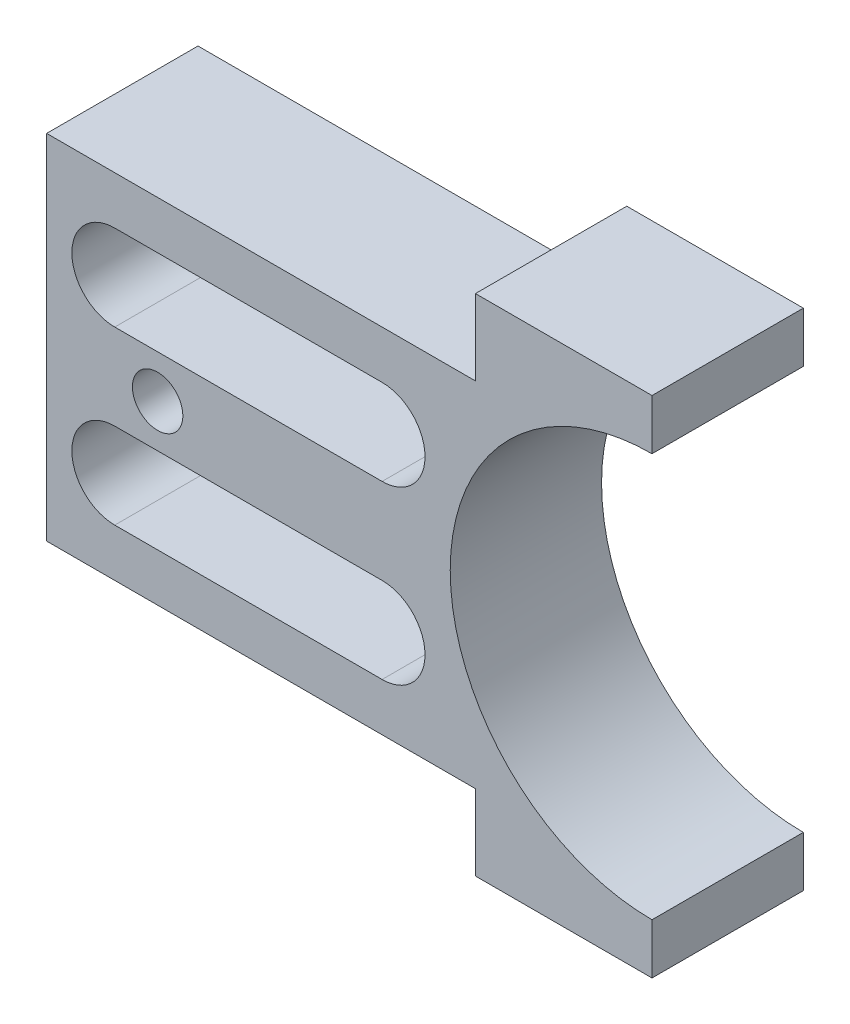
ISO-10303-21;
HEADER;
FILE_DESCRIPTION(('STEP AP214'),'2;1');
FILE_NAME('part.step','',(''),(''),'','','');
FILE_SCHEMA(('AUTOMOTIVE_DESIGN { 1 0 10303 214 1 1 1 1 }'));
ENDSEC;
DATA;
#1=APPLICATION_CONTEXT('core data for automotive mechanical design processes');
#2=APPLICATION_PROTOCOL_DEFINITION('international standard','automotive_design',2000,#1);
#3=PRODUCT_CONTEXT('',#1,'mechanical');
#4=PRODUCT('Part','Part','',(#3));
#5=PRODUCT_RELATED_PRODUCT_CATEGORY('part','',(#4));
#6=PRODUCT_DEFINITION_FORMATION('','',#4);
#7=PRODUCT_DEFINITION_CONTEXT('part definition',#1,'design');
#8=PRODUCT_DEFINITION('design','',#6,#7);
#9=PRODUCT_DEFINITION_SHAPE('','',#8);
#10=(LENGTH_UNIT() NAMED_UNIT(*) SI_UNIT(.MILLI.,.METRE.));
#11=(NAMED_UNIT(*) PLANE_ANGLE_UNIT() SI_UNIT($,.RADIAN.));
#12=(NAMED_UNIT(*) SI_UNIT($,.STERADIAN.) SOLID_ANGLE_UNIT());
#13=UNCERTAINTY_MEASURE_WITH_UNIT(LENGTH_MEASURE(1.E-05),#10,'distance_accuracy_value','');
#14=(GEOMETRIC_REPRESENTATION_CONTEXT(3) GLOBAL_UNCERTAINTY_ASSIGNED_CONTEXT((#13)) GLOBAL_UNIT_ASSIGNED_CONTEXT((#10,
#11,#12)) REPRESENTATION_CONTEXT('',''));
#15=CARTESIAN_POINT('',(0.,0.,0.));
#16=DIRECTION('',(0.,0.,1.));
#17=DIRECTION('',(1.,0.,0.));
#18=AXIS2_PLACEMENT_3D('',#15,#16,#17);
#19=CARTESIAN_POINT('',(60.,0.,30.));
#20=DIRECTION('',(0.,0.,-1.));
#21=DIRECTION('',(-1.,0.,0.));
#22=AXIS2_PLACEMENT_3D('',#19,#20,#21);
#23=CYLINDRICAL_SURFACE('',#22,40.);
#24=CARTESIAN_POINT('',(60.,0.,0.));
#25=DIRECTION('',(0.,0.,1.));
#26=DIRECTION('',(1.,0.,0.));
#27=AXIS2_PLACEMENT_3D('',#24,#25,#26);
#28=CIRCLE('',#27,40.);
#29=CARTESIAN_POINT('',(60.,40.,0.));
#30=VERTEX_POINT('',#29);
#31=CARTESIAN_POINT('',(60.,-40.,0.));
#32=VERTEX_POINT('',#31);
#33=EDGE_CURVE('E207',#30,#32,#28,.T.);
#34=ORIENTED_EDGE('',*,*,#33,.F.);
#35=DIRECTION('',(0.,0.,-1.));
#36=VECTOR('',#35,1.);
#37=CARTESIAN_POINT('',(60.,40.,30.));
#38=LINE('',#37,#36);
#39=CARTESIAN_POINT('',(60.,40.,30.));
#40=VERTEX_POINT('',#39);
#41=EDGE_CURVE('E11',#40,#30,#38,.T.);
#42=ORIENTED_EDGE('',*,*,#41,.F.);
#43=CARTESIAN_POINT('',(60.,0.,30.));
#44=DIRECTION('',(0.,0.,1.));
#45=DIRECTION('',(1.,0.,0.));
#46=AXIS2_PLACEMENT_3D('',#43,#44,#45);
#47=CIRCLE('',#46,40.);
#48=CARTESIAN_POINT('',(60.,-40.,30.));
#49=VERTEX_POINT('',#48);
#50=EDGE_CURVE('E242',#40,#49,#47,.T.);
#51=ORIENTED_EDGE('',*,*,#50,.T.);
#52=DIRECTION('',(0.,0.,-1.));
#53=VECTOR('',#52,1.);
#54=CARTESIAN_POINT('',(60.,-40.,30.));
#55=LINE('',#54,#53);
#56=EDGE_CURVE('E270',#49,#32,#55,.T.);
#57=ORIENTED_EDGE('',*,*,#56,.T.);
#58=EDGE_LOOP('',(#34,#42,#51,#57));
#59=FACE_BOUND('',#58,.T.);
#60=ADVANCED_FACE('F45',(#59),#23,.F.);
#61=CARTESIAN_POINT('',(60.0000000000001,1.2490009027033E-13,30.));
#62=DIRECTION('',(-1.,0.,0.));
#63=DIRECTION('',(0.,-1.,0.));
#64=AXIS2_PLACEMENT_3D('',#61,#62,#63);
#65=PLANE('',#64);
#66=DIRECTION('',(0.,1.,0.));
#67=VECTOR('',#66,1.);
#68=CARTESIAN_POINT('',(60.0000000000001,1.2490009027033E-13,0.));
#69=LINE('',#68,#67);
#70=CARTESIAN_POINT('',(60.,50.,0.));
#71=VERTEX_POINT('',#70);
#72=EDGE_CURVE('E273',#30,#71,#69,.T.);
#73=ORIENTED_EDGE('',*,*,#72,.T.);
#74=DIRECTION('',(0.,0.,-1.));
#75=VECTOR('',#74,1.);
#76=CARTESIAN_POINT('',(60.,50.,30.));
#77=LINE('',#76,#75);
#78=CARTESIAN_POINT('',(60.,50.,30.));
#79=VERTEX_POINT('',#78);
#80=EDGE_CURVE('E52',#79,#71,#77,.T.);
#81=ORIENTED_EDGE('',*,*,#80,.F.);
#82=DIRECTION('',(0.,1.,0.));
#83=VECTOR('',#82,1.);
#84=CARTESIAN_POINT('',(60.0000000000001,1.2490009027033E-13,30.));
#85=LINE('',#84,#83);
#86=EDGE_CURVE('E245',#40,#79,#85,.T.);
#87=ORIENTED_EDGE('',*,*,#86,.F.);
#88=ORIENTED_EDGE('',*,*,#41,.T.);
#89=EDGE_LOOP('',(#73,#81,#87,#88));
#90=FACE_BOUND('',#89,.T.);
#91=ADVANCED_FACE('F321',(#90),#65,.F.);
#92=CARTESIAN_POINT('',(0.,50.,30.));
#93=DIRECTION('',(0.,1.,0.));
#94=DIRECTION('',(0.,0.,1.));
#95=AXIS2_PLACEMENT_3D('',#92,#93,#94);
#96=PLANE('',#95);
#97=DIRECTION('',(1.,0.,0.));
#98=VECTOR('',#97,1.);
#99=CARTESIAN_POINT('',(0.,50.,0.));
#100=LINE('',#99,#98);
#101=CARTESIAN_POINT('',(25.,50.,0.));
#102=VERTEX_POINT('',#101);
#103=EDGE_CURVE('E276',#102,#71,#100,.T.);
#104=ORIENTED_EDGE('',*,*,#103,.F.);
#105=DIRECTION('',(0.,0.,-1.));
#106=VECTOR('',#105,1.);
#107=CARTESIAN_POINT('',(25.,50.,30.));
#108=LINE('',#107,#106);
#109=CARTESIAN_POINT('',(25.,50.,30.));
#110=VERTEX_POINT('',#109);
#111=EDGE_CURVE('E312',#110,#102,#108,.T.);
#112=ORIENTED_EDGE('',*,*,#111,.F.);
#113=DIRECTION('',(1.,0.,0.));
#114=VECTOR('',#113,1.);
#115=CARTESIAN_POINT('',(0.,50.,30.));
#116=LINE('',#115,#114);
#117=EDGE_CURVE('E248',#110,#79,#116,.T.);
#118=ORIENTED_EDGE('',*,*,#117,.T.);
#119=ORIENTED_EDGE('',*,*,#80,.T.);
#120=EDGE_LOOP('',(#104,#112,#118,#119));
#121=FACE_BOUND('',#120,.T.);
#122=ADVANCED_FACE('F316',(#121),#96,.T.);
#123=CARTESIAN_POINT('',(25.,0.,30.));
#124=DIRECTION('',(-1.,0.,0.));
#125=DIRECTION('',(0.,0.,1.));
#126=AXIS2_PLACEMENT_3D('',#123,#124,#125);
#127=PLANE('',#126);
#128=DIRECTION('',(0.,1.,0.));
#129=VECTOR('',#128,1.);
#130=CARTESIAN_POINT('',(25.,0.,0.));
#131=LINE('',#130,#129);
#132=CARTESIAN_POINT('',(25.,35.,0.));
#133=VERTEX_POINT('',#132);
#134=EDGE_CURVE('E279',#133,#102,#131,.T.);
#135=ORIENTED_EDGE('',*,*,#134,.F.);
#136=DIRECTION('',(0.,0.,-1.));
#137=VECTOR('',#136,1.);
#138=CARTESIAN_POINT('',(25.,35.,30.));
#139=LINE('',#138,#137);
#140=CARTESIAN_POINT('',(25.,35.,30.));
#141=VERTEX_POINT('',#140);
#142=EDGE_CURVE('E310',#141,#133,#139,.T.);
#143=ORIENTED_EDGE('',*,*,#142,.F.);
#144=DIRECTION('',(0.,1.,0.));
#145=VECTOR('',#144,1.);
#146=CARTESIAN_POINT('',(25.,0.,30.));
#147=LINE('',#146,#145);
#148=EDGE_CURVE('E251',#141,#110,#147,.T.);
#149=ORIENTED_EDGE('',*,*,#148,.T.);
#150=ORIENTED_EDGE('',*,*,#111,.T.);
#151=EDGE_LOOP('',(#135,#143,#149,#150));
#152=FACE_BOUND('',#151,.T.);
#153=ADVANCED_FACE('F328',(#152),#127,.T.);
#154=CARTESIAN_POINT('',(0.,35.,30.));
#155=DIRECTION('',(0.,-1.,0.));
#156=DIRECTION('',(1.,0.,0.));
#157=AXIS2_PLACEMENT_3D('',#154,#155,#156);
#158=PLANE('',#157);
#159=DIRECTION('',(-1.,0.,0.));
#160=VECTOR('',#159,1.);
#161=CARTESIAN_POINT('',(0.,35.,0.));
#162=LINE('',#161,#160);
#163=CARTESIAN_POINT('',(-60.,35.,0.));
#164=VERTEX_POINT('',#163);
#165=EDGE_CURVE('E282',#133,#164,#162,.T.);
#166=ORIENTED_EDGE('',*,*,#165,.T.);
#167=DIRECTION('',(0.,0.,-1.));
#168=VECTOR('',#167,1.);
#169=CARTESIAN_POINT('',(-60.,35.,30.));
#170=LINE('',#169,#168);
#171=CARTESIAN_POINT('',(-60.,35.,30.));
#172=VERTEX_POINT('',#171);
#173=EDGE_CURVE('E307',#172,#164,#170,.T.);
#174=ORIENTED_EDGE('',*,*,#173,.F.);
#175=DIRECTION('',(-1.,0.,0.));
#176=VECTOR('',#175,1.);
#177=CARTESIAN_POINT('',(0.,35.,30.));
#178=LINE('',#177,#176);
#179=EDGE_CURVE('E254',#141,#172,#178,.T.);
#180=ORIENTED_EDGE('',*,*,#179,.F.);
#181=ORIENTED_EDGE('',*,*,#142,.T.);
#182=EDGE_LOOP('',(#166,#174,#180,#181));
#183=FACE_BOUND('',#182,.T.);
#184=ADVANCED_FACE('F357',(#183),#158,.F.);
#185=CARTESIAN_POINT('',(-60.,0.,30.));
#186=DIRECTION('',(1.,0.,0.));
#187=DIRECTION('',(0.,0.,-1.));
#188=AXIS2_PLACEMENT_3D('',#185,#186,#187);
#189=PLANE('',#188);
#190=DIRECTION('',(0.,-1.,0.));
#191=VECTOR('',#190,1.);
#192=CARTESIAN_POINT('',(-60.,0.,0.));
#193=LINE('',#192,#191);
#194=CARTESIAN_POINT('',(-60.,-35.,0.));
#195=VERTEX_POINT('',#194);
#196=EDGE_CURVE('E284',#164,#195,#193,.T.);
#197=ORIENTED_EDGE('',*,*,#196,.T.);
#198=DIRECTION('',(0.,0.,-1.));
#199=VECTOR('',#198,1.);
#200=CARTESIAN_POINT('',(-60.,-35.,30.));
#201=LINE('',#200,#199);
#202=CARTESIAN_POINT('',(-60.,-35.,30.));
#203=VERTEX_POINT('',#202);
#204=EDGE_CURVE('E305',#203,#195,#201,.T.);
#205=ORIENTED_EDGE('',*,*,#204,.F.);
#206=DIRECTION('',(0.,-1.,0.));
#207=VECTOR('',#206,1.);
#208=CARTESIAN_POINT('',(-60.,0.,30.));
#209=LINE('',#208,#207);
#210=EDGE_CURVE('E256',#172,#203,#209,.T.);
#211=ORIENTED_EDGE('',*,*,#210,.F.);
#212=ORIENTED_EDGE('',*,*,#173,.T.);
#213=EDGE_LOOP('',(#197,#205,#211,#212));
#214=FACE_BOUND('',#213,.T.);
#215=ADVANCED_FACE('F354',(#214),#189,.F.);
#216=CARTESIAN_POINT('',(0.,-35.,30.));
#217=DIRECTION('',(0.,-1.,0.));
#218=DIRECTION('',(1.,0.,0.));
#219=AXIS2_PLACEMENT_3D('',#216,#217,#218);
#220=PLANE('',#219);
#221=DIRECTION('',(-1.,0.,0.));
#222=VECTOR('',#221,1.);
#223=CARTESIAN_POINT('',(0.,-35.,0.));
#224=LINE('',#223,#222);
#225=CARTESIAN_POINT('',(25.,-35.,0.));
#226=VERTEX_POINT('',#225);
#227=EDGE_CURVE('E287',#226,#195,#224,.T.);
#228=ORIENTED_EDGE('',*,*,#227,.F.);
#229=DIRECTION('',(0.,0.,-1.));
#230=VECTOR('',#229,1.);
#231=CARTESIAN_POINT('',(25.,-35.,30.));
#232=LINE('',#231,#230);
#233=CARTESIAN_POINT('',(25.,-35.,30.));
#234=VERTEX_POINT('',#233);
#235=EDGE_CURVE('E303',#234,#226,#232,.T.);
#236=ORIENTED_EDGE('',*,*,#235,.F.);
#237=DIRECTION('',(-1.,0.,0.));
#238=VECTOR('',#237,1.);
#239=CARTESIAN_POINT('',(0.,-35.,30.));
#240=LINE('',#239,#238);
#241=EDGE_CURVE('E258',#234,#203,#240,.T.);
#242=ORIENTED_EDGE('',*,*,#241,.T.);
#243=ORIENTED_EDGE('',*,*,#204,.T.);
#244=EDGE_LOOP('',(#228,#236,#242,#243));
#245=FACE_BOUND('',#244,.T.);
#246=ADVANCED_FACE('F350',(#245),#220,.T.);
#247=CARTESIAN_POINT('',(25.,0.,30.));
#248=DIRECTION('',(-1.,0.,0.));
#249=DIRECTION('',(0.,0.,1.));
#250=AXIS2_PLACEMENT_3D('',#247,#248,#249);
#251=PLANE('',#250);
#252=DIRECTION('',(0.,1.,0.));
#253=VECTOR('',#252,1.);
#254=CARTESIAN_POINT('',(25.,0.,0.));
#255=LINE('',#254,#253);
#256=CARTESIAN_POINT('',(25.,-50.,0.));
#257=VERTEX_POINT('',#256);
#258=EDGE_CURVE('E290',#257,#226,#255,.T.);
#259=ORIENTED_EDGE('',*,*,#258,.F.);
#260=DIRECTION('',(0.,0.,-1.));
#261=VECTOR('',#260,1.);
#262=CARTESIAN_POINT('',(25.,-50.,30.));
#263=LINE('',#262,#261);
#264=CARTESIAN_POINT('',(25.,-50.,30.));
#265=VERTEX_POINT('',#264);
#266=EDGE_CURVE('E301',#265,#257,#263,.T.);
#267=ORIENTED_EDGE('',*,*,#266,.F.);
#268=DIRECTION('',(0.,1.,0.));
#269=VECTOR('',#268,1.);
#270=CARTESIAN_POINT('',(25.,0.,30.));
#271=LINE('',#270,#269);
#272=EDGE_CURVE('E261',#265,#234,#271,.T.);
#273=ORIENTED_EDGE('',*,*,#272,.T.);
#274=ORIENTED_EDGE('',*,*,#235,.T.);
#275=EDGE_LOOP('',(#259,#267,#273,#274));
#276=FACE_BOUND('',#275,.T.);
#277=ADVANCED_FACE('F346',(#276),#251,.T.);
#278=CARTESIAN_POINT('',(0.,-50.,30.));
#279=DIRECTION('',(0.,-1.,0.));
#280=DIRECTION('',(1.,0.,0.));
#281=AXIS2_PLACEMENT_3D('',#278,#279,#280);
#282=PLANE('',#281);
#283=DIRECTION('',(-1.,0.,0.));
#284=VECTOR('',#283,1.);
#285=CARTESIAN_POINT('',(0.,-50.,0.));
#286=LINE('',#285,#284);
#287=CARTESIAN_POINT('',(60.,-50.,0.));
#288=VERTEX_POINT('',#287);
#289=EDGE_CURVE('E293',#288,#257,#286,.T.);
#290=ORIENTED_EDGE('',*,*,#289,.F.);
#291=DIRECTION('',(0.,0.,-1.));
#292=VECTOR('',#291,1.);
#293=CARTESIAN_POINT('',(60.,-50.,30.));
#294=LINE('',#293,#292);
#295=CARTESIAN_POINT('',(60.,-50.,30.));
#296=VERTEX_POINT('',#295);
#297=EDGE_CURVE('E299',#296,#288,#294,.T.);
#298=ORIENTED_EDGE('',*,*,#297,.F.);
#299=DIRECTION('',(-1.,0.,0.));
#300=VECTOR('',#299,1.);
#301=CARTESIAN_POINT('',(0.,-50.,30.));
#302=LINE('',#301,#300);
#303=EDGE_CURVE('E264',#296,#265,#302,.T.);
#304=ORIENTED_EDGE('',*,*,#303,.T.);
#305=ORIENTED_EDGE('',*,*,#266,.T.);
#306=EDGE_LOOP('',(#290,#298,#304,#305));
#307=FACE_BOUND('',#306,.T.);
#308=ADVANCED_FACE('F342',(#307),#282,.T.);
#309=CARTESIAN_POINT('',(60.,0.,30.));
#310=DIRECTION('',(1.,0.,0.));
#311=DIRECTION('',(0.,1.,0.));
#312=AXIS2_PLACEMENT_3D('',#309,#310,#311);
#313=PLANE('',#312);
#314=DIRECTION('',(0.,-1.,0.));
#315=VECTOR('',#314,1.);
#316=CARTESIAN_POINT('',(60.,0.,0.));
#317=LINE('',#316,#315);
#318=EDGE_CURVE('E246',#32,#288,#317,.T.);
#319=ORIENTED_EDGE('',*,*,#318,.F.);
#320=ORIENTED_EDGE('',*,*,#56,.F.);
#321=DIRECTION('',(0.,-1.,0.));
#322=VECTOR('',#321,1.);
#323=CARTESIAN_POINT('',(60.,0.,30.));
#324=LINE('',#323,#322);
#325=EDGE_CURVE('E267',#49,#296,#324,.T.);
#326=ORIENTED_EDGE('',*,*,#325,.T.);
#327=ORIENTED_EDGE('',*,*,#297,.T.);
#328=EDGE_LOOP('',(#319,#320,#326,#327));
#329=FACE_BOUND('',#328,.T.);
#330=ADVANCED_FACE('F339',(#329),#313,.T.);
#331=CARTESIAN_POINT('',(0.,0.,30.));
#332=DIRECTION('',(0.,0.,1.));
#333=DIRECTION('',(1.,0.,0.));
#334=AXIS2_PLACEMENT_3D('',#331,#332,#333);
#335=PLANE('',#334);
#336=CARTESIAN_POINT('',(-38.,0.,30.));
#337=DIRECTION('',(0.,0.,1.));
#338=DIRECTION('',(1.,0.,0.));
#339=AXIS2_PLACEMENT_3D('',#336,#337,#338);
#340=CIRCLE('',#339,5.);
#341=CARTESIAN_POINT('',(-33.,0.,30.));
#342=VERTEX_POINT('',#341);
#343=EDGE_CURVE('E195',#342,#342,#340,.T.);
#344=ORIENTED_EDGE('',*,*,#343,.F.);
#345=EDGE_LOOP('',(#344));
#346=FACE_BOUND('',#345,.T.);
#347=CARTESIAN_POINT('',(-46.5,17.,30.));
#348=DIRECTION('',(0.,0.,1.));
#349=DIRECTION('',(1.,0.,0.));
#350=AXIS2_PLACEMENT_3D('',#347,#348,#349);
#351=CIRCLE('',#350,8.5);
#352=CARTESIAN_POINT('',(-46.5,25.5,30.));
#353=VERTEX_POINT('',#352);
#354=CARTESIAN_POINT('',(-46.5,8.50000000000001,30.));
#355=VERTEX_POINT('',#354);
#356=EDGE_CURVE('E59',#353,#355,#351,.T.);
#357=ORIENTED_EDGE('',*,*,#356,.F.);
#358=DIRECTION('',(-1.,0.,0.));
#359=VECTOR('',#358,1.);
#360=CARTESIAN_POINT('',(-46.5,25.5,30.));
#361=LINE('',#360,#359);
#362=CARTESIAN_POINT('',(6.49999999999998,25.5,30.));
#363=VERTEX_POINT('',#362);
#364=EDGE_CURVE('E189',#363,#353,#361,.T.);
#365=ORIENTED_EDGE('',*,*,#364,.F.);
#366=CARTESIAN_POINT('',(6.49999999999998,17.,30.));
#367=DIRECTION('',(0.,0.,1.));
#368=DIRECTION('',(1.,0.,0.));
#369=AXIS2_PLACEMENT_3D('',#366,#367,#368);
#370=CIRCLE('',#369,8.5);
#371=CARTESIAN_POINT('',(6.49999999999998,8.50000000000001,30.));
#372=VERTEX_POINT('',#371);
#373=EDGE_CURVE('E192',#372,#363,#370,.T.);
#374=ORIENTED_EDGE('',*,*,#373,.F.);
#375=DIRECTION('',(1.,0.,0.));
#376=VECTOR('',#375,1.);
#377=CARTESIAN_POINT('',(-46.5,8.50000000000001,30.));
#378=LINE('',#377,#376);
#379=EDGE_CURVE('E201',#355,#372,#378,.T.);
#380=ORIENTED_EDGE('',*,*,#379,.F.);
#381=EDGE_LOOP('',(#357,#365,#374,#380));
#382=FACE_BOUND('',#381,.T.);
#383=CARTESIAN_POINT('',(-46.5,-17.,30.));
#384=DIRECTION('',(0.,0.,1.));
#385=DIRECTION('',(-1.,0.,0.));
#386=AXIS2_PLACEMENT_3D('',#383,#384,#385);
#387=CIRCLE('',#386,8.5);
#388=CARTESIAN_POINT('',(-46.5,-8.49999999999999,30.));
#389=VERTEX_POINT('',#388);
#390=CARTESIAN_POINT('',(-46.5,-25.5,30.));
#391=VERTEX_POINT('',#390);
#392=EDGE_CURVE('E67',#389,#391,#387,.T.);
#393=ORIENTED_EDGE('',*,*,#392,.F.);
#394=DIRECTION('',(-1.,0.,0.));
#395=VECTOR('',#394,1.);
#396=CARTESIAN_POINT('',(-46.5,-8.49999999999999,30.));
#397=LINE('',#396,#395);
#398=CARTESIAN_POINT('',(6.49999999999998,-8.49999999999999,30.));
#399=VERTEX_POINT('',#398);
#400=EDGE_CURVE('E221',#399,#389,#397,.T.);
#401=ORIENTED_EDGE('',*,*,#400,.F.);
#402=CARTESIAN_POINT('',(6.49999999999998,-17.,30.));
#403=DIRECTION('',(0.,0.,1.));
#404=DIRECTION('',(-1.,0.,0.));
#405=AXIS2_PLACEMENT_3D('',#402,#403,#404);
#406=CIRCLE('',#405,8.5);
#407=CARTESIAN_POINT('',(6.49999999999998,-25.5,30.));
#408=VERTEX_POINT('',#407);
#409=EDGE_CURVE('E224',#408,#399,#406,.T.);
#410=ORIENTED_EDGE('',*,*,#409,.F.);
#411=DIRECTION('',(1.,0.,0.));
#412=VECTOR('',#411,1.);
#413=CARTESIAN_POINT('',(-46.5,-25.5,30.));
#414=LINE('',#413,#412);
#415=EDGE_CURVE('E228',#391,#408,#414,.T.);
#416=ORIENTED_EDGE('',*,*,#415,.F.);
#417=EDGE_LOOP('',(#393,#401,#410,#416));
#418=FACE_BOUND('',#417,.T.);
#419=ORIENTED_EDGE('',*,*,#50,.F.);
#420=ORIENTED_EDGE('',*,*,#86,.T.);
#421=ORIENTED_EDGE('',*,*,#117,.F.);
#422=ORIENTED_EDGE('',*,*,#148,.F.);
#423=ORIENTED_EDGE('',*,*,#179,.T.);
#424=ORIENTED_EDGE('',*,*,#210,.T.);
#425=ORIENTED_EDGE('',*,*,#241,.F.);
#426=ORIENTED_EDGE('',*,*,#272,.F.);
#427=ORIENTED_EDGE('',*,*,#303,.F.);
#428=ORIENTED_EDGE('',*,*,#325,.F.);
#429=EDGE_LOOP('',(#419,#420,#421,#422,#423,#424,#425,#426,#427,#428));
#430=FACE_BOUND('',#429,.T.);
#431=ADVANCED_FACE('F333',(#346,#382,#418,#430),#335,.T.);
#432=CARTESIAN_POINT('',(0.,0.,0.));
#433=DIRECTION('',(0.,0.,1.));
#434=DIRECTION('',(1.,0.,0.));
#435=AXIS2_PLACEMENT_3D('',#432,#433,#434);
#436=PLANE('',#435);
#437=CARTESIAN_POINT('',(-38.,0.,0.));
#438=DIRECTION('',(0.,0.,1.));
#439=DIRECTION('',(1.,0.,0.));
#440=AXIS2_PLACEMENT_3D('',#437,#438,#439);
#441=CIRCLE('',#440,5.);
#442=CARTESIAN_POINT('',(-33.,0.,0.));
#443=VERTEX_POINT('',#442);
#444=EDGE_CURVE('E220',#443,#443,#441,.T.);
#445=ORIENTED_EDGE('',*,*,#444,.T.);
#446=EDGE_LOOP('',(#445));
#447=FACE_BOUND('',#446,.T.);
#448=DIRECTION('',(-1.,0.,0.));
#449=VECTOR('',#448,1.);
#450=CARTESIAN_POINT('',(-46.5,25.5,0.));
#451=LINE('',#450,#449);
#452=CARTESIAN_POINT('',(6.49999999999998,25.5,0.));
#453=VERTEX_POINT('',#452);
#454=CARTESIAN_POINT('',(-46.5,25.5,0.));
#455=VERTEX_POINT('',#454);
#456=EDGE_CURVE('E176',#453,#455,#451,.T.);
#457=ORIENTED_EDGE('',*,*,#456,.T.);
#458=CARTESIAN_POINT('',(-46.5,17.,0.));
#459=DIRECTION('',(0.,0.,1.));
#460=DIRECTION('',(1.,0.,0.));
#461=AXIS2_PLACEMENT_3D('',#458,#459,#460);
#462=CIRCLE('',#461,8.5);
#463=CARTESIAN_POINT('',(-46.5,8.50000000000001,0.));
#464=VERTEX_POINT('',#463);
#465=EDGE_CURVE('E170',#455,#464,#462,.T.);
#466=ORIENTED_EDGE('',*,*,#465,.T.);
#467=DIRECTION('',(1.,0.,0.));
#468=VECTOR('',#467,1.);
#469=CARTESIAN_POINT('',(-46.5,8.50000000000001,0.));
#470=LINE('',#469,#468);
#471=CARTESIAN_POINT('',(6.49999999999998,8.50000000000001,0.));
#472=VERTEX_POINT('',#471);
#473=EDGE_CURVE('E180',#464,#472,#470,.T.);
#474=ORIENTED_EDGE('',*,*,#473,.T.);
#475=CARTESIAN_POINT('',(6.49999999999998,17.,0.));
#476=DIRECTION('',(0.,0.,1.));
#477=DIRECTION('',(1.,0.,0.));
#478=AXIS2_PLACEMENT_3D('',#475,#476,#477);
#479=CIRCLE('',#478,8.5);
#480=EDGE_CURVE('E184',#472,#453,#479,.T.);
#481=ORIENTED_EDGE('',*,*,#480,.T.);
#482=EDGE_LOOP('',(#457,#466,#474,#481));
#483=FACE_BOUND('',#482,.T.);
#484=DIRECTION('',(-1.,0.,0.));
#485=VECTOR('',#484,1.);
#486=CARTESIAN_POINT('',(-46.5,-8.49999999999999,0.));
#487=LINE('',#486,#485);
#488=CARTESIAN_POINT('',(6.49999999999998,-8.49999999999999,0.));
#489=VERTEX_POINT('',#488);
#490=CARTESIAN_POINT('',(-46.5,-8.49999999999999,0.));
#491=VERTEX_POINT('',#490);
#492=EDGE_CURVE('E213',#489,#491,#487,.T.);
#493=ORIENTED_EDGE('',*,*,#492,.T.);
#494=CARTESIAN_POINT('',(-46.5,-17.,0.));
#495=DIRECTION('',(0.,0.,1.));
#496=DIRECTION('',(-1.,0.,0.));
#497=AXIS2_PLACEMENT_3D('',#494,#495,#496);
#498=CIRCLE('',#497,8.5);
#499=CARTESIAN_POINT('',(-46.5,-25.5,0.));
#500=VERTEX_POINT('',#499);
#501=EDGE_CURVE('E225',#491,#500,#498,.T.);
#502=ORIENTED_EDGE('',*,*,#501,.T.);
#503=DIRECTION('',(1.,0.,0.));
#504=VECTOR('',#503,1.);
#505=CARTESIAN_POINT('',(-46.5,-25.5,0.));
#506=LINE('',#505,#504);
#507=CARTESIAN_POINT('',(6.49999999999998,-25.5,0.));
#508=VERTEX_POINT('',#507);
#509=EDGE_CURVE('E237',#500,#508,#506,.T.);
#510=ORIENTED_EDGE('',*,*,#509,.T.);
#511=CARTESIAN_POINT('',(6.49999999999998,-17.,0.));
#512=DIRECTION('',(0.,0.,1.));
#513=DIRECTION('',(-1.,0.,0.));
#514=AXIS2_PLACEMENT_3D('',#511,#512,#513);
#515=CIRCLE('',#514,8.5);
#516=EDGE_CURVE('E234',#508,#489,#515,.T.);
#517=ORIENTED_EDGE('',*,*,#516,.T.);
#518=EDGE_LOOP('',(#493,#502,#510,#517));
#519=FACE_BOUND('',#518,.T.);
#520=ORIENTED_EDGE('',*,*,#33,.T.);
#521=ORIENTED_EDGE('',*,*,#318,.T.);
#522=ORIENTED_EDGE('',*,*,#289,.T.);
#523=ORIENTED_EDGE('',*,*,#258,.T.);
#524=ORIENTED_EDGE('',*,*,#227,.T.);
#525=ORIENTED_EDGE('',*,*,#196,.F.);
#526=ORIENTED_EDGE('',*,*,#165,.F.);
#527=ORIENTED_EDGE('',*,*,#134,.T.);
#528=ORIENTED_EDGE('',*,*,#103,.T.);
#529=ORIENTED_EDGE('',*,*,#72,.F.);
#530=EDGE_LOOP('',(#520,#521,#522,#523,#524,#525,#526,#527,#528,#529));
#531=FACE_BOUND('',#530,.T.);
#532=ADVANCED_FACE('F186',(#447,#483,#519,#531),#436,.F.);
#533=CARTESIAN_POINT('',(-46.5,-17.,0.));
#534=DIRECTION('',(0.,0.,1.));
#535=DIRECTION('',(1.,0.,0.));
#536=AXIS2_PLACEMENT_3D('',#533,#534,#535);
#537=CYLINDRICAL_SURFACE('',#536,8.5);
#538=ORIENTED_EDGE('',*,*,#392,.T.);
#539=DIRECTION('',(0.,0.,1.));
#540=VECTOR('',#539,1.);
#541=CARTESIAN_POINT('',(-46.5,-25.5,0.));
#542=LINE('',#541,#540);
#543=EDGE_CURVE('E211',#500,#391,#542,.T.);
#544=ORIENTED_EDGE('',*,*,#543,.F.);
#545=ORIENTED_EDGE('',*,*,#501,.F.);
#546=DIRECTION('',(0.,0.,1.));
#547=VECTOR('',#546,1.);
#548=CARTESIAN_POINT('',(-46.5,-8.49999999999999,0.));
#549=LINE('',#548,#547);
#550=EDGE_CURVE('E218',#491,#389,#549,.T.);
#551=ORIENTED_EDGE('',*,*,#550,.T.);
#552=EDGE_LOOP('',(#538,#544,#545,#551));
#553=FACE_BOUND('',#552,.T.);
#554=ADVANCED_FACE('F456',(#553),#537,.F.);
#555=CARTESIAN_POINT('',(-46.5,-8.49999999999999,0.));
#556=DIRECTION('',(0.,1.,0.));
#557=DIRECTION('',(0.,0.,1.));
#558=AXIS2_PLACEMENT_3D('',#555,#556,#557);
#559=PLANE('',#558);
#560=ORIENTED_EDGE('',*,*,#400,.T.);
#561=ORIENTED_EDGE('',*,*,#550,.F.);
#562=ORIENTED_EDGE('',*,*,#492,.F.);
#563=DIRECTION('',(0.,0.,1.));
#564=VECTOR('',#563,1.);
#565=CARTESIAN_POINT('',(6.49999999999998,-8.49999999999999,0.));
#566=LINE('',#565,#564);
#567=EDGE_CURVE('E216',#489,#399,#566,.T.);
#568=ORIENTED_EDGE('',*,*,#567,.T.);
#569=EDGE_LOOP('',(#560,#561,#562,#568));
#570=FACE_BOUND('',#569,.T.);
#571=ADVANCED_FACE('F478',(#570),#559,.F.);
#572=CARTESIAN_POINT('',(6.49999999999998,-17.,0.));
#573=DIRECTION('',(0.,0.,1.));
#574=DIRECTION('',(1.,0.,0.));
#575=AXIS2_PLACEMENT_3D('',#572,#573,#574);
#576=CYLINDRICAL_SURFACE('',#575,8.5);
#577=ORIENTED_EDGE('',*,*,#409,.T.);
#578=ORIENTED_EDGE('',*,*,#567,.F.);
#579=ORIENTED_EDGE('',*,*,#516,.F.);
#580=DIRECTION('',(0.,0.,1.));
#581=VECTOR('',#580,1.);
#582=CARTESIAN_POINT('',(6.49999999999998,-25.5,0.));
#583=LINE('',#582,#581);
#584=EDGE_CURVE('E214',#508,#408,#583,.T.);
#585=ORIENTED_EDGE('',*,*,#584,.T.);
#586=EDGE_LOOP('',(#577,#578,#579,#585));
#587=FACE_BOUND('',#586,.T.);
#588=ADVANCED_FACE('F487',(#587),#576,.F.);
#589=CARTESIAN_POINT('',(-46.5,-25.5,0.));
#590=DIRECTION('',(0.,-1.,0.));
#591=DIRECTION('',(0.,0.,-1.));
#592=AXIS2_PLACEMENT_3D('',#589,#590,#591);
#593=PLANE('',#592);
#594=ORIENTED_EDGE('',*,*,#415,.T.);
#595=ORIENTED_EDGE('',*,*,#584,.F.);
#596=ORIENTED_EDGE('',*,*,#509,.F.);
#597=ORIENTED_EDGE('',*,*,#543,.T.);
#598=EDGE_LOOP('',(#594,#595,#596,#597));
#599=FACE_BOUND('',#598,.T.);
#600=ADVANCED_FACE('F497',(#599),#593,.F.);
#601=CARTESIAN_POINT('',(-46.5,17.,0.));
#602=DIRECTION('',(0.,0.,1.));
#603=DIRECTION('',(1.,0.,0.));
#604=AXIS2_PLACEMENT_3D('',#601,#602,#603);
#605=CYLINDRICAL_SURFACE('',#604,8.5);
#606=ORIENTED_EDGE('',*,*,#356,.T.);
#607=DIRECTION('',(0.,0.,1.));
#608=VECTOR('',#607,1.);
#609=CARTESIAN_POINT('',(-46.5,8.50000000000001,0.));
#610=LINE('',#609,#608);
#611=EDGE_CURVE('E166',#464,#355,#610,.T.);
#612=ORIENTED_EDGE('',*,*,#611,.F.);
#613=ORIENTED_EDGE('',*,*,#465,.F.);
#614=DIRECTION('',(0.,0.,1.));
#615=VECTOR('',#614,1.);
#616=CARTESIAN_POINT('',(-46.5,25.5,0.));
#617=LINE('',#616,#615);
#618=EDGE_CURVE('E205',#455,#353,#617,.T.);
#619=ORIENTED_EDGE('',*,*,#618,.T.);
#620=EDGE_LOOP('',(#606,#612,#613,#619));
#621=FACE_BOUND('',#620,.T.);
#622=ADVANCED_FACE('F168',(#621),#605,.F.);
#623=CARTESIAN_POINT('',(-46.5,25.5,0.));
#624=DIRECTION('',(0.,1.,0.));
#625=DIRECTION('',(0.,0.,1.));
#626=AXIS2_PLACEMENT_3D('',#623,#624,#625);
#627=PLANE('',#626);
#628=ORIENTED_EDGE('',*,*,#364,.T.);
#629=ORIENTED_EDGE('',*,*,#618,.F.);
#630=ORIENTED_EDGE('',*,*,#456,.F.);
#631=DIRECTION('',(0.,0.,1.));
#632=VECTOR('',#631,1.);
#633=CARTESIAN_POINT('',(6.49999999999998,25.5,0.));
#634=LINE('',#633,#632);
#635=EDGE_CURVE('E208',#453,#363,#634,.T.);
#636=ORIENTED_EDGE('',*,*,#635,.T.);
#637=EDGE_LOOP('',(#628,#629,#630,#636));
#638=FACE_BOUND('',#637,.T.);
#639=ADVANCED_FACE('F516',(#638),#627,.F.);
#640=CARTESIAN_POINT('',(6.49999999999998,17.,0.));
#641=DIRECTION('',(0.,0.,1.));
#642=DIRECTION('',(1.,0.,0.));
#643=AXIS2_PLACEMENT_3D('',#640,#641,#642);
#644=CYLINDRICAL_SURFACE('',#643,8.5);
#645=ORIENTED_EDGE('',*,*,#373,.T.);
#646=ORIENTED_EDGE('',*,*,#635,.F.);
#647=ORIENTED_EDGE('',*,*,#480,.F.);
#648=DIRECTION('',(0.,0.,1.));
#649=VECTOR('',#648,1.);
#650=CARTESIAN_POINT('',(6.49999999999998,8.50000000000001,0.));
#651=LINE('',#650,#649);
#652=EDGE_CURVE('E175',#472,#372,#651,.T.);
#653=ORIENTED_EDGE('',*,*,#652,.T.);
#654=EDGE_LOOP('',(#645,#646,#647,#653));
#655=FACE_BOUND('',#654,.T.);
#656=ADVANCED_FACE('F525',(#655),#644,.F.);
#657=CARTESIAN_POINT('',(-46.5,8.50000000000001,0.));
#658=DIRECTION('',(0.,-1.,0.));
#659=DIRECTION('',(0.,0.,-1.));
#660=AXIS2_PLACEMENT_3D('',#657,#658,#659);
#661=PLANE('',#660);
#662=ORIENTED_EDGE('',*,*,#379,.T.);
#663=ORIENTED_EDGE('',*,*,#652,.F.);
#664=ORIENTED_EDGE('',*,*,#473,.F.);
#665=ORIENTED_EDGE('',*,*,#611,.T.);
#666=EDGE_LOOP('',(#662,#663,#664,#665));
#667=FACE_BOUND('',#666,.T.);
#668=ADVANCED_FACE('F181',(#667),#661,.F.);
#669=CARTESIAN_POINT('',(-38.,0.,0.));
#670=DIRECTION('',(0.,0.,1.));
#671=DIRECTION('',(1.,0.,0.));
#672=AXIS2_PLACEMENT_3D('',#669,#670,#671);
#673=CYLINDRICAL_SURFACE('',#672,5.);
#674=ORIENTED_EDGE('',*,*,#444,.F.);
#675=EDGE_LOOP('',(#674));
#676=FACE_BOUND('',#675,.T.);
#677=ORIENTED_EDGE('',*,*,#343,.T.);
#678=EDGE_LOOP('',(#677));
#679=FACE_BOUND('',#678,.T.);
#680=ADVANCED_FACE('F543',(#676,#679),#673,.F.);
#681=CLOSED_SHELL('',(#60,#91,#122,#153,#184,#215,#246,#277,#308,#330,#431,#532,#554,#571,#588,
#600,#622,#639,#656,#668,#680));
#682=MANIFOLD_SOLID_BREP('B2',#681);
#683=ADVANCED_BREP_SHAPE_REPRESENTATION('',(#18,#682),#14);
#684=SHAPE_DEFINITION_REPRESENTATION(#9,#683);
ENDSEC;
END-ISO-10303-21;
